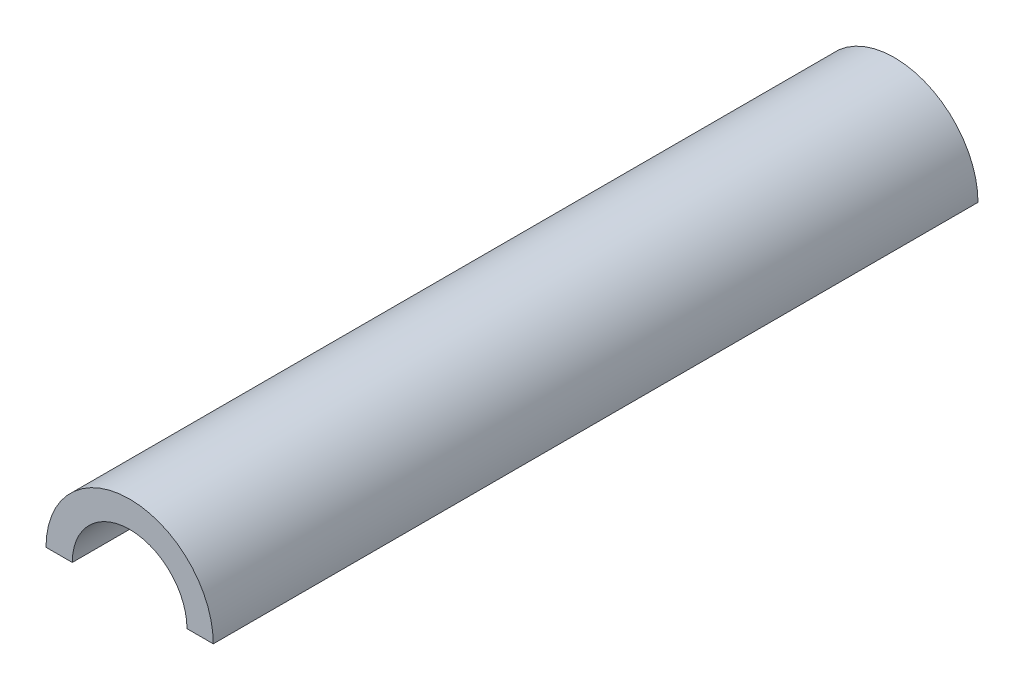
ISO-10303-21;
HEADER;
FILE_DESCRIPTION(('STEP AP214'),'2;1');
FILE_NAME('part.step','',(''),(''),'','','');
FILE_SCHEMA(('AUTOMOTIVE_DESIGN { 1 0 10303 214 1 1 1 1 }'));
ENDSEC;
DATA;
#1=APPLICATION_CONTEXT('core data for automotive mechanical design processes');
#2=APPLICATION_PROTOCOL_DEFINITION('international standard','automotive_design',2000,#1);
#3=PRODUCT_CONTEXT('',#1,'mechanical');
#4=PRODUCT('Part','Part','',(#3));
#5=PRODUCT_RELATED_PRODUCT_CATEGORY('part','',(#4));
#6=PRODUCT_DEFINITION_FORMATION('','',#4);
#7=PRODUCT_DEFINITION_CONTEXT('part definition',#1,'design');
#8=PRODUCT_DEFINITION('design','',#6,#7);
#9=PRODUCT_DEFINITION_SHAPE('','',#8);
#10=(LENGTH_UNIT() NAMED_UNIT(*) SI_UNIT(.MILLI.,.METRE.));
#11=(NAMED_UNIT(*) PLANE_ANGLE_UNIT() SI_UNIT($,.RADIAN.));
#12=(NAMED_UNIT(*) SI_UNIT($,.STERADIAN.) SOLID_ANGLE_UNIT());
#13=UNCERTAINTY_MEASURE_WITH_UNIT(LENGTH_MEASURE(1.E-05),#10,'distance_accuracy_value','');
#14=(GEOMETRIC_REPRESENTATION_CONTEXT(3) GLOBAL_UNCERTAINTY_ASSIGNED_CONTEXT((#13)) GLOBAL_UNIT_ASSIGNED_CONTEXT((#10,
#11,#12)) REPRESENTATION_CONTEXT('',''));
#15=CARTESIAN_POINT('',(0.,0.,0.));
#16=DIRECTION('',(0.,0.,1.));
#17=DIRECTION('',(1.,0.,0.));
#18=AXIS2_PLACEMENT_3D('',#15,#16,#17);
#19=CARTESIAN_POINT('',(0.,0.,80.));
#20=DIRECTION('',(0.,0.,-1.));
#21=DIRECTION('',(-1.,0.,0.));
#22=AXIS2_PLACEMENT_3D('',#19,#20,#21);
#23=CYLINDRICAL_SURFACE('',#22,17.5);
#24=CARTESIAN_POINT('',(0.,0.,-80.));
#25=DIRECTION('',(0.,0.,1.));
#26=DIRECTION('',(1.,0.,0.));
#27=AXIS2_PLACEMENT_3D('',#24,#25,#26);
#28=CIRCLE('',#27,17.5);
#29=CARTESIAN_POINT('',(17.5,0.,-80.));
#30=VERTEX_POINT('',#29);
#31=CARTESIAN_POINT('',(-17.5,0.,-80.));
#32=VERTEX_POINT('',#31);
#33=EDGE_CURVE('E96',#30,#32,#28,.T.);
#34=ORIENTED_EDGE('',*,*,#33,.T.);
#35=DIRECTION('',(0.,0.,-1.));
#36=VECTOR('',#35,1.);
#37=CARTESIAN_POINT('',(-17.5,0.,80.));
#38=LINE('',#37,#36);
#39=CARTESIAN_POINT('',(-17.5,0.,80.));
#40=VERTEX_POINT('',#39);
#41=EDGE_CURVE('E11',#40,#32,#38,.T.);
#42=ORIENTED_EDGE('',*,*,#41,.F.);
#43=CARTESIAN_POINT('',(0.,0.,80.));
#44=DIRECTION('',(0.,0.,1.));
#45=DIRECTION('',(1.,0.,0.));
#46=AXIS2_PLACEMENT_3D('',#43,#44,#45);
#47=CIRCLE('',#46,17.5);
#48=CARTESIAN_POINT('',(17.5,0.,80.));
#49=VERTEX_POINT('',#48);
#50=EDGE_CURVE('E84',#49,#40,#47,.T.);
#51=ORIENTED_EDGE('',*,*,#50,.F.);
#52=DIRECTION('',(0.,0.,-1.));
#53=VECTOR('',#52,1.);
#54=CARTESIAN_POINT('',(17.5,0.,80.));
#55=LINE('',#54,#53);
#56=EDGE_CURVE('E92',#49,#30,#55,.T.);
#57=ORIENTED_EDGE('',*,*,#56,.T.);
#58=EDGE_LOOP('',(#34,#42,#51,#57));
#59=FACE_BOUND('',#58,.T.);
#60=ADVANCED_FACE('F33',(#59),#23,.T.);
#61=CARTESIAN_POINT('',(-12.,0.,80.));
#62=DIRECTION('',(0.,1.,0.));
#63=DIRECTION('',(0.,0.,1.));
#64=AXIS2_PLACEMENT_3D('',#61,#62,#63);
#65=PLANE('',#64);
#66=DIRECTION('',(1.,0.,0.));
#67=VECTOR('',#66,1.);
#68=CARTESIAN_POINT('',(-12.,0.,-80.));
#69=LINE('',#68,#67);
#70=CARTESIAN_POINT('',(-12.,0.,-80.));
#71=VERTEX_POINT('',#70);
#72=EDGE_CURVE('E88',#32,#71,#69,.T.);
#73=ORIENTED_EDGE('',*,*,#72,.T.);
#74=DIRECTION('',(0.,0.,-1.));
#75=VECTOR('',#74,1.);
#76=CARTESIAN_POINT('',(-12.,0.,80.));
#77=LINE('',#76,#75);
#78=CARTESIAN_POINT('',(-12.,0.,80.));
#79=VERTEX_POINT('',#78);
#80=EDGE_CURVE('E41',#79,#71,#77,.T.);
#81=ORIENTED_EDGE('',*,*,#80,.F.);
#82=DIRECTION('',(1.,0.,0.));
#83=VECTOR('',#82,1.);
#84=CARTESIAN_POINT('',(-12.,0.,80.));
#85=LINE('',#84,#83);
#86=EDGE_CURVE('E79',#40,#79,#85,.T.);
#87=ORIENTED_EDGE('',*,*,#86,.F.);
#88=ORIENTED_EDGE('',*,*,#41,.T.);
#89=EDGE_LOOP('',(#73,#81,#87,#88));
#90=FACE_BOUND('',#89,.T.);
#91=ADVANCED_FACE('F87',(#90),#65,.F.);
#92=CARTESIAN_POINT('',(0.,0.,80.));
#93=DIRECTION('',(0.,0.,-1.));
#94=DIRECTION('',(-1.,0.,0.));
#95=AXIS2_PLACEMENT_3D('',#92,#93,#94);
#96=CYLINDRICAL_SURFACE('',#95,12.);
#97=CARTESIAN_POINT('',(0.,0.,-80.));
#98=DIRECTION('',(0.,0.,-1.));
#99=DIRECTION('',(1.,0.,0.));
#100=AXIS2_PLACEMENT_3D('',#97,#98,#99);
#101=CIRCLE('',#100,12.);
#102=CARTESIAN_POINT('',(12.,0.,-80.));
#103=VERTEX_POINT('',#102);
#104=EDGE_CURVE('E66',#71,#103,#101,.T.);
#105=ORIENTED_EDGE('',*,*,#104,.T.);
#106=DIRECTION('',(0.,0.,-1.));
#107=VECTOR('',#106,1.);
#108=CARTESIAN_POINT('',(12.,0.,80.));
#109=LINE('',#108,#107);
#110=CARTESIAN_POINT('',(12.,0.,80.));
#111=VERTEX_POINT('',#110);
#112=EDGE_CURVE('E89',#111,#103,#109,.T.);
#113=ORIENTED_EDGE('',*,*,#112,.F.);
#114=CARTESIAN_POINT('',(0.,0.,80.));
#115=DIRECTION('',(0.,0.,-1.));
#116=DIRECTION('',(1.,0.,0.));
#117=AXIS2_PLACEMENT_3D('',#114,#115,#116);
#118=CIRCLE('',#117,12.);
#119=EDGE_CURVE('E82',#79,#111,#118,.T.);
#120=ORIENTED_EDGE('',*,*,#119,.F.);
#121=ORIENTED_EDGE('',*,*,#80,.T.);
#122=EDGE_LOOP('',(#105,#113,#120,#121));
#123=FACE_BOUND('',#122,.T.);
#124=ADVANCED_FACE('F90',(#123),#96,.F.);
#125=CARTESIAN_POINT('',(17.5,0.,80.));
#126=DIRECTION('',(0.,1.,0.));
#127=DIRECTION('',(0.,0.,1.));
#128=AXIS2_PLACEMENT_3D('',#125,#126,#127);
#129=PLANE('',#128);
#130=DIRECTION('',(1.,0.,0.));
#131=VECTOR('',#130,1.);
#132=CARTESIAN_POINT('',(17.5,0.,-80.));
#133=LINE('',#132,#131);
#134=EDGE_CURVE('E72',#103,#30,#133,.T.);
#135=ORIENTED_EDGE('',*,*,#134,.T.);
#136=ORIENTED_EDGE('',*,*,#56,.F.);
#137=DIRECTION('',(1.,0.,0.));
#138=VECTOR('',#137,1.);
#139=CARTESIAN_POINT('',(17.5,0.,80.));
#140=LINE('',#139,#138);
#141=EDGE_CURVE('E49',#111,#49,#140,.T.);
#142=ORIENTED_EDGE('',*,*,#141,.F.);
#143=ORIENTED_EDGE('',*,*,#112,.T.);
#144=EDGE_LOOP('',(#135,#136,#142,#143));
#145=FACE_BOUND('',#144,.T.);
#146=ADVANCED_FACE('F103',(#145),#129,.F.);
#147=CARTESIAN_POINT('',(0.,0.,80.));
#148=DIRECTION('',(0.,0.,1.));
#149=DIRECTION('',(1.,0.,0.));
#150=AXIS2_PLACEMENT_3D('',#147,#148,#149);
#151=PLANE('',#150);
#152=ORIENTED_EDGE('',*,*,#50,.T.);
#153=ORIENTED_EDGE('',*,*,#86,.T.);
#154=ORIENTED_EDGE('',*,*,#119,.T.);
#155=ORIENTED_EDGE('',*,*,#141,.T.);
#156=EDGE_LOOP('',(#152,#153,#154,#155));
#157=FACE_BOUND('',#156,.T.);
#158=ADVANCED_FACE('F80',(#157),#151,.T.);
#159=CARTESIAN_POINT('',(0.,0.,-80.));
#160=DIRECTION('',(0.,0.,1.));
#161=DIRECTION('',(1.,0.,0.));
#162=AXIS2_PLACEMENT_3D('',#159,#160,#161);
#163=PLANE('',#162);
#164=ORIENTED_EDGE('',*,*,#33,.F.);
#165=ORIENTED_EDGE('',*,*,#134,.F.);
#166=ORIENTED_EDGE('',*,*,#104,.F.);
#167=ORIENTED_EDGE('',*,*,#72,.F.);
#168=EDGE_LOOP('',(#164,#165,#166,#167));
#169=FACE_BOUND('',#168,.T.);
#170=ADVANCED_FACE('F106',(#169),#163,.F.);
#171=CLOSED_SHELL('',(#60,#91,#124,#146,#158,#170));
#172=MANIFOLD_SOLID_BREP('B2',#171);
#173=ADVANCED_BREP_SHAPE_REPRESENTATION('',(#18,#172),#14);
#174=SHAPE_DEFINITION_REPRESENTATION(#9,#173);
ENDSEC;
END-ISO-10303-21;
